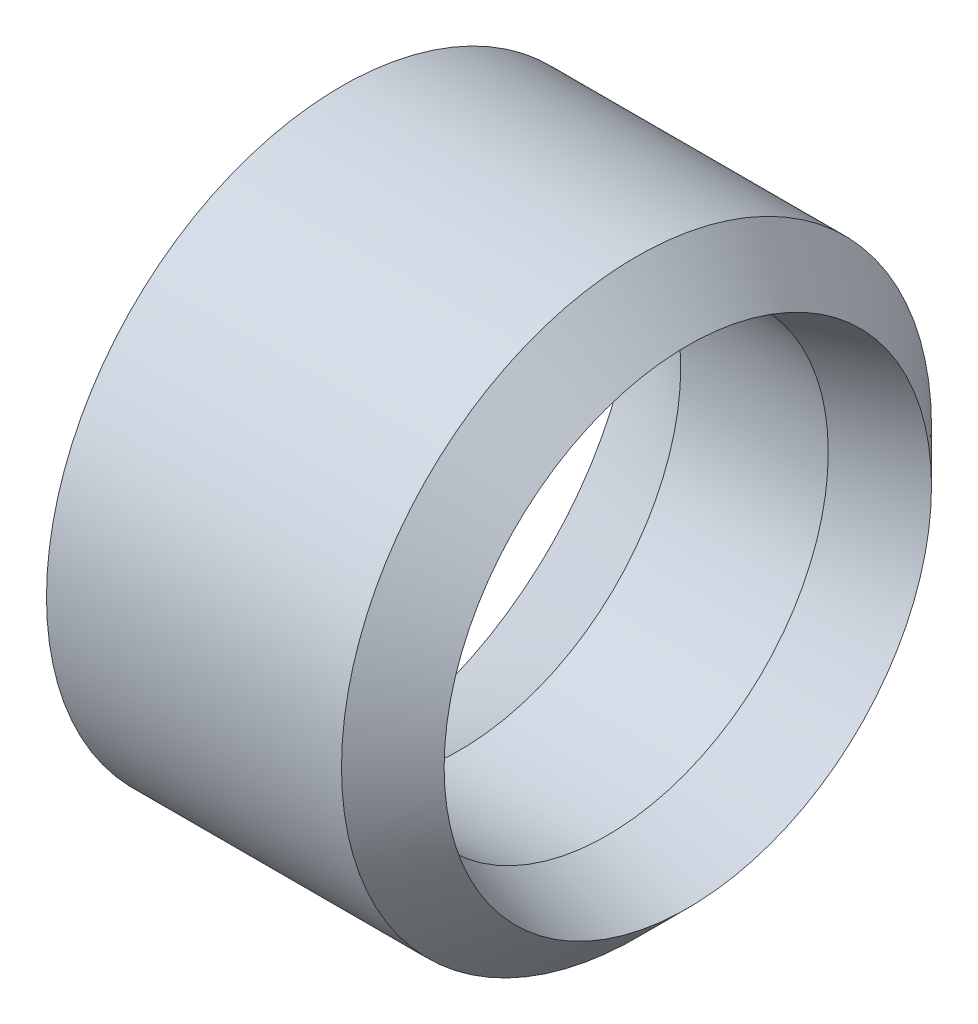
ISO-10303-21;
HEADER;
FILE_DESCRIPTION(('STEP AP214'),'2;1');
FILE_NAME('part.step','',(''),(''),'','','');
FILE_SCHEMA(('AUTOMOTIVE_DESIGN { 1 0 10303 214 1 1 1 1 }'));
ENDSEC;
DATA;
#1=APPLICATION_CONTEXT('core data for automotive mechanical design processes');
#2=APPLICATION_PROTOCOL_DEFINITION('international standard','automotive_design',2000,#1);
#3=PRODUCT_CONTEXT('',#1,'mechanical');
#4=PRODUCT('Part','Part','',(#3));
#5=PRODUCT_RELATED_PRODUCT_CATEGORY('part','',(#4));
#6=PRODUCT_DEFINITION_FORMATION('','',#4);
#7=PRODUCT_DEFINITION_CONTEXT('part definition',#1,'design');
#8=PRODUCT_DEFINITION('design','',#6,#7);
#9=PRODUCT_DEFINITION_SHAPE('','',#8);
#10=(LENGTH_UNIT() NAMED_UNIT(*) SI_UNIT(.MILLI.,.METRE.));
#11=(NAMED_UNIT(*) PLANE_ANGLE_UNIT() SI_UNIT($,.RADIAN.));
#12=(NAMED_UNIT(*) SI_UNIT($,.STERADIAN.) SOLID_ANGLE_UNIT());
#13=UNCERTAINTY_MEASURE_WITH_UNIT(LENGTH_MEASURE(1.E-05),#10,'distance_accuracy_value','');
#14=(GEOMETRIC_REPRESENTATION_CONTEXT(3) GLOBAL_UNCERTAINTY_ASSIGNED_CONTEXT((#13)) GLOBAL_UNIT_ASSIGNED_CONTEXT((#10,
#11,#12)) REPRESENTATION_CONTEXT('',''));
#15=CARTESIAN_POINT('',(0.,0.,0.));
#16=DIRECTION('',(0.,0.,1.));
#17=DIRECTION('',(1.,0.,0.));
#18=AXIS2_PLACEMENT_3D('',#15,#16,#17);
#19=CARTESIAN_POINT('',(0.,0.,0.));
#20=DIRECTION('',(-1.,0.,0.));
#21=DIRECTION('',(0.,0.,1.));
#22=AXIS2_PLACEMENT_3D('',#19,#20,#21);
#23=CYLINDRICAL_SURFACE('',#22,19.05);
#24=CARTESIAN_POINT('',(12.7,0.,0.));
#25=DIRECTION('',(-1.,0.,0.));
#26=DIRECTION('',(0.,0.,1.));
#27=AXIS2_PLACEMENT_3D('',#24,#25,#26);
#28=CIRCLE('',#27,19.05);
#29=CARTESIAN_POINT('',(12.7,0.,19.05));
#30=VERTEX_POINT('',#29);
#31=EDGE_CURVE('E10',#30,#30,#28,.T.);
#32=ORIENTED_EDGE('',*,*,#31,.F.);
#33=EDGE_LOOP('',(#32));
#34=FACE_BOUND('',#33,.T.);
#35=CARTESIAN_POINT('',(0.,0.,0.));
#36=DIRECTION('',(-1.,0.,0.));
#37=DIRECTION('',(0.,0.,1.));
#38=AXIS2_PLACEMENT_3D('',#35,#36,#37);
#39=CIRCLE('',#38,19.05);
#40=CARTESIAN_POINT('',(0.,0.,19.05));
#41=VERTEX_POINT('',#40);
#42=EDGE_CURVE('E62',#41,#41,#39,.T.);
#43=ORIENTED_EDGE('',*,*,#42,.T.);
#44=EDGE_LOOP('',(#43));
#45=FACE_BOUND('',#44,.T.);
#46=ADVANCED_FACE('F43',(#34,#45),#23,.F.);
#47=CARTESIAN_POINT('',(12.7,0.,0.));
#48=DIRECTION('',(1.,0.,0.));
#49=DIRECTION('',(0.,0.,-1.));
#50=AXIS2_PLACEMENT_3D('',#47,#48,#49);
#51=CONICAL_SURFACE('',#50,19.05,0.270946850338421);
#52=CARTESIAN_POINT('',(19.6573913043479,0.,0.));
#53=DIRECTION('',(-1.,0.,0.));
#54=DIRECTION('',(0.,0.,1.));
#55=AXIS2_PLACEMENT_3D('',#52,#53,#54);
#56=CIRCLE('',#55,20.9826086956522);
#57=CARTESIAN_POINT('',(19.6573913043479,0.,20.9826086956522));
#58=VERTEX_POINT('',#57);
#59=EDGE_CURVE('E49',#58,#58,#56,.T.);
#60=ORIENTED_EDGE('',*,*,#59,.F.);
#61=EDGE_LOOP('',(#60));
#62=FACE_BOUND('',#61,.T.);
#63=ORIENTED_EDGE('',*,*,#31,.T.);
#64=EDGE_LOOP('',(#63));
#65=FACE_BOUND('',#64,.T.);
#66=ADVANCED_FACE('F79',(#62,#65),#51,.F.);
#67=CARTESIAN_POINT('',(19.6573913043479,0.,0.));
#68=DIRECTION('',(-1.,0.,0.));
#69=DIRECTION('',(0.,0.,1.));
#70=AXIS2_PLACEMENT_3D('',#67,#68,#69);
#71=CONICAL_SURFACE('',#70,20.9826086956522,0.785398163397442);
#72=CARTESIAN_POINT('',(15.24,0.,0.));
#73=DIRECTION('',(-1.,0.,0.));
#74=DIRECTION('',(0.,0.,1.));
#75=AXIS2_PLACEMENT_3D('',#72,#73,#74);
#76=CIRCLE('',#75,25.4);
#77=CARTESIAN_POINT('',(15.24,0.,25.4));
#78=VERTEX_POINT('',#77);
#79=EDGE_CURVE('E53',#78,#78,#76,.T.);
#80=ORIENTED_EDGE('',*,*,#79,.F.);
#81=EDGE_LOOP('',(#80));
#82=FACE_BOUND('',#81,.T.);
#83=ORIENTED_EDGE('',*,*,#59,.T.);
#84=EDGE_LOOP('',(#83));
#85=FACE_BOUND('',#84,.T.);
#86=ADVANCED_FACE('F75',(#82,#85),#71,.T.);
#87=CARTESIAN_POINT('',(0.,0.,0.));
#88=DIRECTION('',(-1.,0.,0.));
#89=DIRECTION('',(0.,0.,1.));
#90=AXIS2_PLACEMENT_3D('',#87,#88,#89);
#91=CYLINDRICAL_SURFACE('',#90,25.4);
#92=ORIENTED_EDGE('',*,*,#79,.T.);
#93=EDGE_LOOP('',(#92));
#94=FACE_BOUND('',#93,.T.);
#95=CARTESIAN_POINT('',(-10.16,0.,0.));
#96=DIRECTION('',(-1.,0.,0.));
#97=DIRECTION('',(0.,0.,1.));
#98=AXIS2_PLACEMENT_3D('',#95,#96,#97);
#99=CIRCLE('',#98,25.4);
#100=CARTESIAN_POINT('',(-10.16,0.,25.4));
#101=VERTEX_POINT('',#100);
#102=EDGE_CURVE('E57',#101,#101,#99,.T.);
#103=ORIENTED_EDGE('',*,*,#102,.F.);
#104=EDGE_LOOP('',(#103));
#105=FACE_BOUND('',#104,.T.);
#106=ADVANCED_FACE('F69',(#94,#105),#91,.T.);
#107=CARTESIAN_POINT('',(0.,0.,0.));
#108=DIRECTION('',(-1.,0.,0.));
#109=DIRECTION('',(0.,0.,1.));
#110=AXIS2_PLACEMENT_3D('',#107,#108,#109);
#111=CONICAL_SURFACE('',#110,19.05,0.558599315343562);
#112=ORIENTED_EDGE('',*,*,#102,.T.);
#113=EDGE_LOOP('',(#112));
#114=FACE_BOUND('',#113,.T.);
#115=ORIENTED_EDGE('',*,*,#42,.F.);
#116=EDGE_LOOP('',(#115));
#117=FACE_BOUND('',#116,.T.);
#118=ADVANCED_FACE('F67',(#114,#117),#111,.F.);
#119=CLOSED_SHELL('',(#46,#66,#86,#106,#118));
#120=MANIFOLD_SOLID_BREP('B2',#119);
#121=ADVANCED_BREP_SHAPE_REPRESENTATION('',(#18,#120),#14);
#122=SHAPE_DEFINITION_REPRESENTATION(#9,#121);
ENDSEC;
END-ISO-10303-21;
